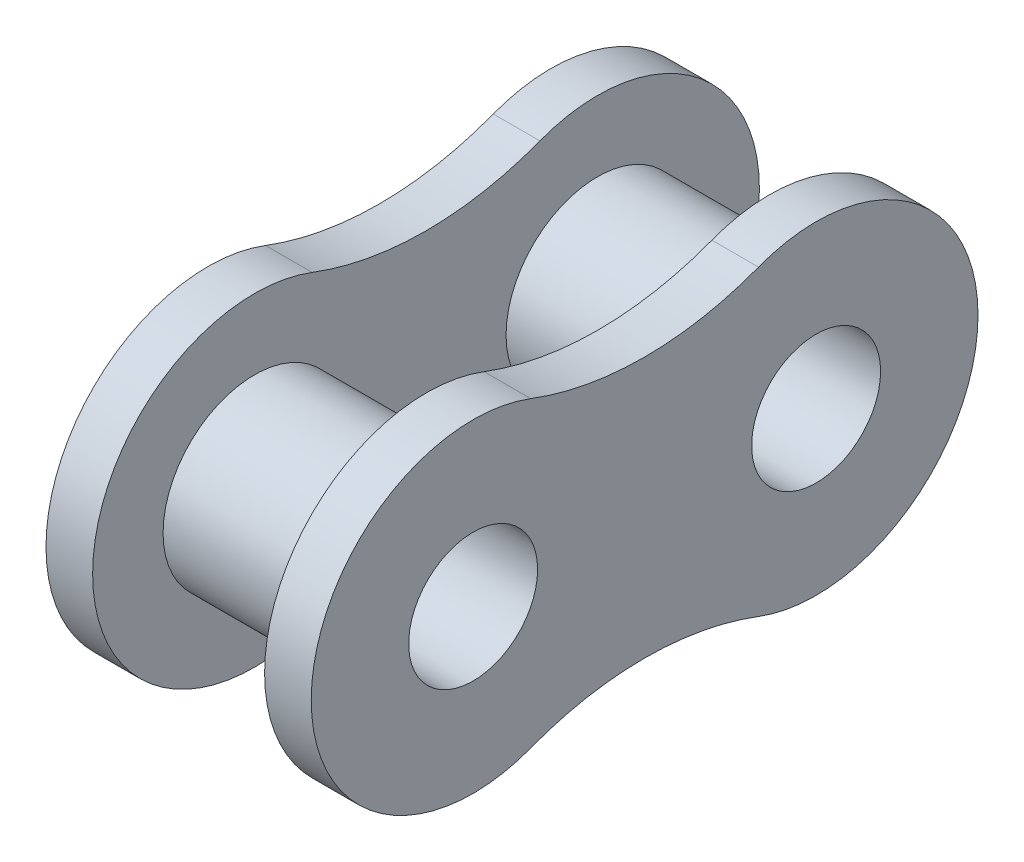
ISO-10303-21;
HEADER;
FILE_DESCRIPTION(('STEP AP214'),'2;1');
FILE_NAME('part.step','',(''),(''),'','','');
FILE_SCHEMA(('AUTOMOTIVE_DESIGN { 1 0 10303 214 1 1 1 1 }'));
ENDSEC;
DATA;
#1=APPLICATION_CONTEXT('core data for automotive mechanical design processes');
#2=APPLICATION_PROTOCOL_DEFINITION('international standard','automotive_design',2000,#1);
#3=PRODUCT_CONTEXT('',#1,'mechanical');
#4=PRODUCT('Part','Part','',(#3));
#5=PRODUCT_RELATED_PRODUCT_CATEGORY('part','',(#4));
#6=PRODUCT_DEFINITION_FORMATION('','',#4);
#7=PRODUCT_DEFINITION_CONTEXT('part definition',#1,'design');
#8=PRODUCT_DEFINITION('design','',#6,#7);
#9=PRODUCT_DEFINITION_SHAPE('','',#8);
#10=(LENGTH_UNIT() NAMED_UNIT(*) SI_UNIT(.MILLI.,.METRE.));
#11=(NAMED_UNIT(*) PLANE_ANGLE_UNIT() SI_UNIT($,.RADIAN.));
#12=(NAMED_UNIT(*) SI_UNIT($,.STERADIAN.) SOLID_ANGLE_UNIT());
#13=UNCERTAINTY_MEASURE_WITH_UNIT(LENGTH_MEASURE(1.E-05),#10,'distance_accuracy_value','');
#14=(GEOMETRIC_REPRESENTATION_CONTEXT(3) GLOBAL_UNCERTAINTY_ASSIGNED_CONTEXT((#13)) GLOBAL_UNIT_ASSIGNED_CONTEXT((#10,
#11,#12)) REPRESENTATION_CONTEXT('',''));
#15=CARTESIAN_POINT('',(0.,0.,0.));
#16=DIRECTION('',(0.,0.,1.));
#17=DIRECTION('',(1.,0.,0.));
#18=AXIS2_PLACEMENT_3D('',#15,#16,#17);
#19=CARTESIAN_POINT('',(-3.683,12.5099254749978,-4.7625));
#20=DIRECTION('',(1.,0.,0.));
#21=DIRECTION('',(0.,0.,-1.));
#22=AXIS2_PLACEMENT_3D('',#19,#20,#21);
#23=CYLINDRICAL_SURFACE('',#22,8.89);
#24=CARTESIAN_POINT('',(-2.3876,12.5099254749978,-4.7625));
#25=DIRECTION('',(1.,0.,0.));
#26=DIRECTION('',(0.,0.,-1.));
#27=AXIS2_PLACEMENT_3D('',#24,#25,#26);
#28=CIRCLE('',#27,8.89);
#29=CARTESIAN_POINT('',(-2.3876,4.201625823671,-1.59954933586338));
#30=VERTEX_POINT('',#29);
#31=CARTESIAN_POINT('',(-2.3876,4.201625823671,-7.92545066413661));
#32=VERTEX_POINT('',#31);
#33=EDGE_CURVE('E185',#30,#32,#28,.T.);
#34=ORIENTED_EDGE('',*,*,#33,.T.);
#35=DIRECTION('',(1.,0.,0.));
#36=VECTOR('',#35,1.);
#37=CARTESIAN_POINT('',(-3.683,4.201625823671,-7.92545066413661));
#38=LINE('',#37,#36);
#39=CARTESIAN_POINT('',(-3.683,4.201625823671,-7.92545066413661));
#40=VERTEX_POINT('',#39);
#41=EDGE_CURVE('E13',#40,#32,#38,.T.);
#42=ORIENTED_EDGE('',*,*,#41,.F.);
#43=CARTESIAN_POINT('',(-3.683,12.5099254749978,-4.7625));
#44=DIRECTION('',(1.,0.,0.));
#45=DIRECTION('',(0.,0.,-1.));
#46=AXIS2_PLACEMENT_3D('',#43,#44,#45);
#47=CIRCLE('',#46,8.89);
#48=CARTESIAN_POINT('',(-3.683,4.201625823671,-1.59954933586338));
#49=VERTEX_POINT('',#48);
#50=EDGE_CURVE('E158',#49,#40,#47,.T.);
#51=ORIENTED_EDGE('',*,*,#50,.F.);
#52=DIRECTION('',(1.,0.,0.));
#53=VECTOR('',#52,1.);
#54=CARTESIAN_POINT('',(-3.683,4.201625823671,-1.59954933586338));
#55=LINE('',#54,#53);
#56=EDGE_CURVE('E131',#49,#30,#55,.T.);
#57=ORIENTED_EDGE('',*,*,#56,.T.);
#58=EDGE_LOOP('',(#34,#42,#51,#57));
#59=FACE_BOUND('',#58,.T.);
#60=ADVANCED_FACE('F120',(#59),#23,.F.);
#61=CARTESIAN_POINT('',(-3.683,0.,-9.525));
#62=DIRECTION('',(1.,0.,0.));
#63=DIRECTION('',(0.,0.,-1.));
#64=AXIS2_PLACEMENT_3D('',#61,#62,#63);
#65=CYLINDRICAL_SURFACE('',#64,4.4958);
#66=CARTESIAN_POINT('',(-2.3876,0.,-9.525));
#67=DIRECTION('',(1.,0.,0.));
#68=DIRECTION('',(0.,0.,-1.));
#69=AXIS2_PLACEMENT_3D('',#66,#67,#68);
#70=CIRCLE('',#69,4.4958);
#71=CARTESIAN_POINT('',(-2.3876,-4.201625823671,-7.92545066413662));
#72=VERTEX_POINT('',#71);
#73=EDGE_CURVE('E169',#72,#32,#70,.T.);
#74=ORIENTED_EDGE('',*,*,#73,.F.);
#75=DIRECTION('',(1.,0.,0.));
#76=VECTOR('',#75,1.);
#77=CARTESIAN_POINT('',(-3.683,-4.201625823671,-7.92545066413662));
#78=LINE('',#77,#76);
#79=CARTESIAN_POINT('',(-3.683,-4.201625823671,-7.92545066413662));
#80=VERTEX_POINT('',#79);
#81=EDGE_CURVE('E124',#80,#72,#78,.T.);
#82=ORIENTED_EDGE('',*,*,#81,.F.);
#83=CARTESIAN_POINT('',(-3.683,0.,-9.525));
#84=DIRECTION('',(1.,0.,0.));
#85=DIRECTION('',(0.,0.,-1.));
#86=AXIS2_PLACEMENT_3D('',#83,#84,#85);
#87=CIRCLE('',#86,4.4958);
#88=EDGE_CURVE('E167',#80,#40,#87,.T.);
#89=ORIENTED_EDGE('',*,*,#88,.T.);
#90=ORIENTED_EDGE('',*,*,#41,.T.);
#91=EDGE_LOOP('',(#74,#82,#89,#90));
#92=FACE_BOUND('',#91,.T.);
#93=ADVANCED_FACE('F164',(#92),#65,.T.);
#94=CARTESIAN_POINT('',(-3.683,-12.5099254749978,-4.7625));
#95=DIRECTION('',(1.,0.,0.));
#96=DIRECTION('',(0.,0.,-1.));
#97=AXIS2_PLACEMENT_3D('',#94,#95,#96);
#98=CYLINDRICAL_SURFACE('',#97,8.89);
#99=CARTESIAN_POINT('',(-2.3876,-12.5099254749978,-4.7625));
#100=DIRECTION('',(1.,0.,0.));
#101=DIRECTION('',(0.,0.,-1.));
#102=AXIS2_PLACEMENT_3D('',#99,#100,#101);
#103=CIRCLE('',#102,8.89);
#104=CARTESIAN_POINT('',(-2.3876,-4.201625823671,-1.59954933586338));
#105=VERTEX_POINT('',#104);
#106=EDGE_CURVE('E188',#72,#105,#103,.T.);
#107=ORIENTED_EDGE('',*,*,#106,.T.);
#108=DIRECTION('',(1.,0.,0.));
#109=VECTOR('',#108,1.);
#110=CARTESIAN_POINT('',(-3.683,-4.201625823671,-1.59954933586338));
#111=LINE('',#110,#109);
#112=CARTESIAN_POINT('',(-3.683,-4.201625823671,-1.59954933586338));
#113=VERTEX_POINT('',#112);
#114=EDGE_CURVE('E150',#113,#105,#111,.T.);
#115=ORIENTED_EDGE('',*,*,#114,.F.);
#116=CARTESIAN_POINT('',(-3.683,-12.5099254749978,-4.7625));
#117=DIRECTION('',(1.,0.,0.));
#118=DIRECTION('',(0.,0.,-1.));
#119=AXIS2_PLACEMENT_3D('',#116,#117,#118);
#120=CIRCLE('',#119,8.89);
#121=EDGE_CURVE('E173',#80,#113,#120,.T.);
#122=ORIENTED_EDGE('',*,*,#121,.F.);
#123=ORIENTED_EDGE('',*,*,#81,.T.);
#124=EDGE_LOOP('',(#107,#115,#122,#123));
#125=FACE_BOUND('',#124,.T.);
#126=ADVANCED_FACE('F175',(#125),#98,.F.);
#127=CARTESIAN_POINT('',(-3.683,0.,0.));
#128=DIRECTION('',(1.,0.,0.));
#129=DIRECTION('',(0.,0.,-1.));
#130=AXIS2_PLACEMENT_3D('',#127,#128,#129);
#131=CYLINDRICAL_SURFACE('',#130,4.4958);
#132=CARTESIAN_POINT('',(-2.3876,0.,0.));
#133=DIRECTION('',(1.,0.,0.));
#134=DIRECTION('',(0.,0.,-1.));
#135=AXIS2_PLACEMENT_3D('',#132,#133,#134);
#136=CIRCLE('',#135,4.4958);
#137=EDGE_CURVE('E180',#30,#105,#136,.T.);
#138=ORIENTED_EDGE('',*,*,#137,.F.);
#139=ORIENTED_EDGE('',*,*,#56,.F.);
#140=CARTESIAN_POINT('',(-3.683,0.,0.));
#141=DIRECTION('',(1.,0.,0.));
#142=DIRECTION('',(0.,0.,-1.));
#143=AXIS2_PLACEMENT_3D('',#140,#141,#142);
#144=CIRCLE('',#143,4.4958);
#145=EDGE_CURVE('E171',#49,#113,#144,.T.);
#146=ORIENTED_EDGE('',*,*,#145,.T.);
#147=ORIENTED_EDGE('',*,*,#114,.T.);
#148=EDGE_LOOP('',(#138,#139,#146,#147));
#149=FACE_BOUND('',#148,.T.);
#150=ADVANCED_FACE('F191',(#149),#131,.T.);
#151=CARTESIAN_POINT('',(-3.683,6.25496273749892,-7.14375));
#152=DIRECTION('',(1.,0.,0.));
#153=DIRECTION('',(0.,0.,-1.));
#154=AXIS2_PLACEMENT_3D('',#151,#152,#153);
#155=PLANE('',#154);
#156=CARTESIAN_POINT('',(-3.683,0.,0.));
#157=DIRECTION('',(1.,0.,0.));
#158=DIRECTION('',(0.,0.,-1.));
#159=AXIS2_PLACEMENT_3D('',#156,#157,#158);
#160=CIRCLE('',#159,1.7907);
#161=CARTESIAN_POINT('',(-3.683,0.,-1.7907));
#162=VERTEX_POINT('',#161);
#163=EDGE_CURVE('E259',#162,#162,#160,.T.);
#164=ORIENTED_EDGE('',*,*,#163,.T.);
#165=EDGE_LOOP('',(#164));
#166=FACE_BOUND('',#165,.T.);
#167=CARTESIAN_POINT('',(-3.683,0.,-9.525));
#168=DIRECTION('',(1.,0.,0.));
#169=DIRECTION('',(0.,0.,-1.));
#170=AXIS2_PLACEMENT_3D('',#167,#168,#169);
#171=CIRCLE('',#170,1.7907);
#172=CARTESIAN_POINT('',(-3.683,0.,-11.3157));
#173=VERTEX_POINT('',#172);
#174=EDGE_CURVE('E184',#173,#173,#171,.T.);
#175=ORIENTED_EDGE('',*,*,#174,.T.);
#176=EDGE_LOOP('',(#175));
#177=FACE_BOUND('',#176,.T.);
#178=ORIENTED_EDGE('',*,*,#50,.T.);
#179=ORIENTED_EDGE('',*,*,#88,.F.);
#180=ORIENTED_EDGE('',*,*,#121,.T.);
#181=ORIENTED_EDGE('',*,*,#145,.F.);
#182=EDGE_LOOP('',(#178,#179,#180,#181));
#183=FACE_BOUND('',#182,.T.);
#184=ADVANCED_FACE('F174',(#166,#177,#183),#155,.F.);
#185=CARTESIAN_POINT('',(-2.3876,6.25496273749892,-7.14375));
#186=DIRECTION('',(1.,0.,0.));
#187=DIRECTION('',(0.,0.,-1.));
#188=AXIS2_PLACEMENT_3D('',#185,#186,#187);
#189=PLANE('',#188);
#190=CARTESIAN_POINT('',(-2.3876,0.,0.));
#191=DIRECTION('',(1.,0.,0.));
#192=DIRECTION('',(0.,0.,-1.));
#193=AXIS2_PLACEMENT_3D('',#190,#191,#192);
#194=CIRCLE('',#193,1.7907);
#195=CARTESIAN_POINT('',(-2.3876,0.,-1.7907));
#196=VERTEX_POINT('',#195);
#197=EDGE_CURVE('E265',#196,#196,#194,.T.);
#198=ORIENTED_EDGE('',*,*,#197,.F.);
#199=EDGE_LOOP('',(#198));
#200=FACE_BOUND('',#199,.T.);
#201=CARTESIAN_POINT('',(-2.3876,0.,-9.525));
#202=DIRECTION('',(1.,0.,0.));
#203=DIRECTION('',(0.,0.,-1.));
#204=AXIS2_PLACEMENT_3D('',#201,#202,#203);
#205=CIRCLE('',#204,1.7907);
#206=CARTESIAN_POINT('',(-2.3876,0.,-11.3157));
#207=VERTEX_POINT('',#206);
#208=EDGE_CURVE('E262',#207,#207,#205,.T.);
#209=ORIENTED_EDGE('',*,*,#208,.F.);
#210=EDGE_LOOP('',(#209));
#211=FACE_BOUND('',#210,.T.);
#212=ORIENTED_EDGE('',*,*,#33,.F.);
#213=ORIENTED_EDGE('',*,*,#137,.T.);
#214=ORIENTED_EDGE('',*,*,#106,.F.);
#215=ORIENTED_EDGE('',*,*,#73,.T.);
#216=EDGE_LOOP('',(#212,#213,#214,#215));
#217=FACE_BOUND('',#216,.T.);
#218=ADVANCED_FACE('F195',(#200,#211,#217),#189,.T.);
#219=CARTESIAN_POINT('',(-3.683,0.,-9.525));
#220=DIRECTION('',(1.,0.,0.));
#221=DIRECTION('',(0.,0.,-1.));
#222=AXIS2_PLACEMENT_3D('',#219,#220,#221);
#223=CYLINDRICAL_SURFACE('',#222,1.7907);
#224=ORIENTED_EDGE('',*,*,#174,.F.);
#225=EDGE_LOOP('',(#224));
#226=FACE_BOUND('',#225,.T.);
#227=ORIENTED_EDGE('',*,*,#208,.T.);
#228=EDGE_LOOP('',(#227));
#229=FACE_BOUND('',#228,.T.);
#230=ADVANCED_FACE('F231',(#226,#229),#223,.F.);
#231=CARTESIAN_POINT('',(-3.683,0.,0.));
#232=DIRECTION('',(1.,0.,0.));
#233=DIRECTION('',(0.,0.,-1.));
#234=AXIS2_PLACEMENT_3D('',#231,#232,#233);
#235=CYLINDRICAL_SURFACE('',#234,1.7907);
#236=ORIENTED_EDGE('',*,*,#163,.F.);
#237=EDGE_LOOP('',(#236));
#238=FACE_BOUND('',#237,.T.);
#239=ORIENTED_EDGE('',*,*,#197,.T.);
#240=EDGE_LOOP('',(#239));
#241=FACE_BOUND('',#240,.T.);
#242=ADVANCED_FACE('F248',(#238,#241),#235,.F.);
#243=CLOSED_SHELL('',(#60,#93,#126,#150,#184,#218,#230,#242));
#244=MANIFOLD_SOLID_BREP('B2',#243);
#245=CARTESIAN_POINT('',(2.3876,6.25496273749892,-7.14375));
#246=DIRECTION('',(1.,0.,0.));
#247=DIRECTION('',(0.,0.,-1.));
#248=AXIS2_PLACEMENT_3D('',#245,#246,#247);
#249=PLANE('',#248);
#250=CARTESIAN_POINT('',(2.3876,12.5099254749978,-4.7625));
#251=DIRECTION('',(1.,0.,0.));
#252=DIRECTION('',(0.,0.,-1.));
#253=AXIS2_PLACEMENT_3D('',#250,#251,#252);
#254=CIRCLE('',#253,8.89);
#255=CARTESIAN_POINT('',(2.3876,4.201625823671,-1.59954933586338));
#256=VERTEX_POINT('',#255);
#257=CARTESIAN_POINT('',(2.3876,4.201625823671,-7.92545066413661));
#258=VERTEX_POINT('',#257);
#259=EDGE_CURVE('E346',#256,#258,#254,.T.);
#260=ORIENTED_EDGE('',*,*,#259,.T.);
#261=CARTESIAN_POINT('',(2.3876,0.,-9.525));
#262=DIRECTION('',(1.,0.,0.));
#263=DIRECTION('',(0.,0.,-1.));
#264=AXIS2_PLACEMENT_3D('',#261,#262,#263);
#265=CIRCLE('',#264,4.4958);
#266=CARTESIAN_POINT('',(2.3876,-4.201625823671,-7.92545066413662));
#267=VERTEX_POINT('',#266);
#268=EDGE_CURVE('E353',#267,#258,#265,.T.);
#269=ORIENTED_EDGE('',*,*,#268,.F.);
#270=CARTESIAN_POINT('',(2.3876,-12.5099254749978,-4.7625));
#271=DIRECTION('',(1.,0.,0.));
#272=DIRECTION('',(0.,0.,-1.));
#273=AXIS2_PLACEMENT_3D('',#270,#271,#272);
#274=CIRCLE('',#273,8.89);
#275=CARTESIAN_POINT('',(2.3876,-4.201625823671,-1.59954933586338));
#276=VERTEX_POINT('',#275);
#277=EDGE_CURVE('E335',#267,#276,#274,.T.);
#278=ORIENTED_EDGE('',*,*,#277,.T.);
#279=CARTESIAN_POINT('',(2.3876,0.,0.));
#280=DIRECTION('',(1.,0.,0.));
#281=DIRECTION('',(0.,0.,-1.));
#282=AXIS2_PLACEMENT_3D('',#279,#280,#281);
#283=CIRCLE('',#282,4.4958);
#284=EDGE_CURVE('E354',#256,#276,#283,.T.);
#285=ORIENTED_EDGE('',*,*,#284,.F.);
#286=EDGE_LOOP('',(#260,#269,#278,#285));
#287=FACE_BOUND('',#286,.T.);
#288=CARTESIAN_POINT('',(2.3876,0.,-9.525));
#289=DIRECTION('',(1.,0.,0.));
#290=DIRECTION('',(0.,0.,-1.));
#291=AXIS2_PLACEMENT_3D('',#288,#289,#290);
#292=CIRCLE('',#291,2.54);
#293=CARTESIAN_POINT('',(2.3876,0.,-12.065));
#294=VERTEX_POINT('',#293);
#295=EDGE_CURVE('E286',#294,#294,#292,.T.);
#296=ORIENTED_EDGE('',*,*,#295,.T.);
#297=EDGE_LOOP('',(#296));
#298=FACE_BOUND('',#297,.T.);
#299=CARTESIAN_POINT('',(2.3876,0.,0.));
#300=DIRECTION('',(1.,0.,0.));
#301=DIRECTION('',(0.,0.,-1.));
#302=AXIS2_PLACEMENT_3D('',#299,#300,#301);
#303=CIRCLE('',#302,2.54);
#304=CARTESIAN_POINT('',(2.3876,0.,-2.54));
#305=VERTEX_POINT('',#304);
#306=EDGE_CURVE('E113',#305,#305,#303,.F.);
#307=ORIENTED_EDGE('',*,*,#306,.F.);
#308=EDGE_LOOP('',(#307));
#309=FACE_BOUND('',#308,.T.);
#310=ADVANCED_FACE('F276',(#287,#298,#309),#249,.F.);
#311=CARTESIAN_POINT('',(2.3876,0.,-9.525));
#312=DIRECTION('',(-1.,0.,0.));
#313=DIRECTION('',(0.,0.,1.));
#314=AXIS2_PLACEMENT_3D('',#311,#312,#313);
#315=CYLINDRICAL_SURFACE('',#314,1.7907);
#316=CARTESIAN_POINT('',(-2.3876,0.,-9.525));
#317=DIRECTION('',(1.,0.,0.));
#318=DIRECTION('',(0.,0.,-1.));
#319=AXIS2_PLACEMENT_3D('',#316,#317,#318);
#320=CIRCLE('',#319,1.7907);
#321=CARTESIAN_POINT('',(-2.3876,0.,-11.3157));
#322=VERTEX_POINT('',#321);
#323=EDGE_CURVE('E356',#322,#322,#320,.T.);
#324=ORIENTED_EDGE('',*,*,#323,.F.);
#325=EDGE_LOOP('',(#324));
#326=FACE_BOUND('',#325,.T.);
#327=CARTESIAN_POINT('',(3.683,0.,-9.525));
#328=DIRECTION('',(1.,0.,0.));
#329=DIRECTION('',(0.,0.,-1.));
#330=AXIS2_PLACEMENT_3D('',#327,#328,#329);
#331=CIRCLE('',#330,1.7907);
#332=CARTESIAN_POINT('',(3.683,0.,-11.3157));
#333=VERTEX_POINT('',#332);
#334=EDGE_CURVE('E355',#333,#333,#331,.T.);
#335=ORIENTED_EDGE('',*,*,#334,.T.);
#336=EDGE_LOOP('',(#335));
#337=FACE_BOUND('',#336,.T.);
#338=ADVANCED_FACE('F283',(#326,#337),#315,.F.);
#339=CARTESIAN_POINT('',(2.3876,0.,-9.525));
#340=DIRECTION('',(-1.,0.,0.));
#341=DIRECTION('',(0.,0.,1.));
#342=AXIS2_PLACEMENT_3D('',#339,#340,#341);
#343=CYLINDRICAL_SURFACE('',#342,2.54);
#344=ORIENTED_EDGE('',*,*,#295,.F.);
#345=EDGE_LOOP('',(#344));
#346=FACE_BOUND('',#345,.T.);
#347=CARTESIAN_POINT('',(-2.3876,0.,-9.525));
#348=DIRECTION('',(1.,0.,0.));
#349=DIRECTION('',(0.,0.,-1.));
#350=AXIS2_PLACEMENT_3D('',#347,#348,#349);
#351=CIRCLE('',#350,2.54);
#352=CARTESIAN_POINT('',(-2.3876,0.,-12.065));
#353=VERTEX_POINT('',#352);
#354=EDGE_CURVE('E361',#353,#353,#351,.T.);
#355=ORIENTED_EDGE('',*,*,#354,.T.);
#356=EDGE_LOOP('',(#355));
#357=FACE_BOUND('',#356,.T.);
#358=ADVANCED_FACE('F366',(#346,#357),#343,.T.);
#359=CARTESIAN_POINT('',(-2.3876,0.,0.));
#360=DIRECTION('',(1.,0.,0.));
#361=DIRECTION('',(0.,0.,-1.));
#362=AXIS2_PLACEMENT_3D('',#359,#360,#361);
#363=PLANE('',#362);
#364=ORIENTED_EDGE('',*,*,#323,.T.);
#365=EDGE_LOOP('',(#364));
#366=FACE_BOUND('',#365,.T.);
#367=ORIENTED_EDGE('',*,*,#354,.F.);
#368=EDGE_LOOP('',(#367));
#369=FACE_BOUND('',#368,.T.);
#370=ADVANCED_FACE('F367',(#366,#369),#363,.F.);
#371=CARTESIAN_POINT('',(3.683,6.25496273749892,-7.14375));
#372=DIRECTION('',(1.,0.,0.));
#373=DIRECTION('',(0.,0.,-1.));
#374=AXIS2_PLACEMENT_3D('',#371,#372,#373);
#375=PLANE('',#374);
#376=ORIENTED_EDGE('',*,*,#334,.F.);
#377=EDGE_LOOP('',(#376));
#378=FACE_BOUND('',#377,.T.);
#379=CARTESIAN_POINT('',(3.683,12.5099254749978,-4.7625));
#380=DIRECTION('',(1.,0.,0.));
#381=DIRECTION('',(0.,0.,-1.));
#382=AXIS2_PLACEMENT_3D('',#379,#380,#381);
#383=CIRCLE('',#382,8.89);
#384=CARTESIAN_POINT('',(3.683,4.201625823671,-1.59954933586338));
#385=VERTEX_POINT('',#384);
#386=CARTESIAN_POINT('',(3.683,4.201625823671,-7.92545066413661));
#387=VERTEX_POINT('',#386);
#388=EDGE_CURVE('E337',#385,#387,#383,.T.);
#389=ORIENTED_EDGE('',*,*,#388,.F.);
#390=CARTESIAN_POINT('',(3.683,0.,0.));
#391=DIRECTION('',(1.,0.,0.));
#392=DIRECTION('',(0.,0.,-1.));
#393=AXIS2_PLACEMENT_3D('',#390,#391,#392);
#394=CIRCLE('',#393,4.4958);
#395=CARTESIAN_POINT('',(3.683,-4.201625823671,-1.59954933586338));
#396=VERTEX_POINT('',#395);
#397=EDGE_CURVE('E341',#385,#396,#394,.T.);
#398=ORIENTED_EDGE('',*,*,#397,.T.);
#399=CARTESIAN_POINT('',(3.683,-12.5099254749978,-4.7625));
#400=DIRECTION('',(1.,0.,0.));
#401=DIRECTION('',(0.,0.,-1.));
#402=AXIS2_PLACEMENT_3D('',#399,#400,#401);
#403=CIRCLE('',#402,8.89);
#404=CARTESIAN_POINT('',(3.683,-4.201625823671,-7.92545066413662));
#405=VERTEX_POINT('',#404);
#406=EDGE_CURVE('E329',#405,#396,#403,.T.);
#407=ORIENTED_EDGE('',*,*,#406,.F.);
#408=CARTESIAN_POINT('',(3.683,0.,-9.525));
#409=DIRECTION('',(1.,0.,0.));
#410=DIRECTION('',(0.,0.,-1.));
#411=AXIS2_PLACEMENT_3D('',#408,#409,#410);
#412=CIRCLE('',#411,4.4958);
#413=EDGE_CURVE('E324',#405,#387,#412,.T.);
#414=ORIENTED_EDGE('',*,*,#413,.T.);
#415=EDGE_LOOP('',(#389,#398,#407,#414));
#416=FACE_BOUND('',#415,.T.);
#417=CARTESIAN_POINT('',(3.683,0.,0.));
#418=DIRECTION('',(1.,0.,0.));
#419=DIRECTION('',(0.,0.,-1.));
#420=AXIS2_PLACEMENT_3D('',#417,#418,#419);
#421=CIRCLE('',#420,1.7907);
#422=CARTESIAN_POINT('',(3.683,0.,-1.7907));
#423=VERTEX_POINT('',#422);
#424=EDGE_CURVE('E408',#423,#423,#421,.T.);
#425=ORIENTED_EDGE('',*,*,#424,.F.);
#426=EDGE_LOOP('',(#425));
#427=FACE_BOUND('',#426,.T.);
#428=ADVANCED_FACE('F343',(#378,#416,#427),#375,.T.);
#429=CARTESIAN_POINT('',(3.683,12.5099254749978,-4.7625));
#430=DIRECTION('',(-1.,0.,0.));
#431=DIRECTION('',(0.,0.,1.));
#432=AXIS2_PLACEMENT_3D('',#429,#430,#431);
#433=CYLINDRICAL_SURFACE('',#432,8.89);
#434=ORIENTED_EDGE('',*,*,#259,.F.);
#435=DIRECTION('',(-1.,0.,0.));
#436=VECTOR('',#435,1.);
#437=CARTESIAN_POINT('',(3.683,4.201625823671,-1.59954933586338));
#438=LINE('',#437,#436);
#439=EDGE_CURVE('E298',#385,#256,#438,.T.);
#440=ORIENTED_EDGE('',*,*,#439,.F.);
#441=ORIENTED_EDGE('',*,*,#388,.T.);
#442=DIRECTION('',(-1.,0.,0.));
#443=VECTOR('',#442,1.);
#444=CARTESIAN_POINT('',(3.683,4.201625823671,-7.92545066413661));
#445=LINE('',#444,#443);
#446=EDGE_CURVE('E338',#387,#258,#445,.T.);
#447=ORIENTED_EDGE('',*,*,#446,.T.);
#448=EDGE_LOOP('',(#434,#440,#441,#447));
#449=FACE_BOUND('',#448,.T.);
#450=ADVANCED_FACE('F378',(#449),#433,.F.);
#451=CARTESIAN_POINT('',(3.683,0.,0.));
#452=DIRECTION('',(-1.,0.,0.));
#453=DIRECTION('',(0.,0.,1.));
#454=AXIS2_PLACEMENT_3D('',#451,#452,#453);
#455=CYLINDRICAL_SURFACE('',#454,4.4958);
#456=ORIENTED_EDGE('',*,*,#284,.T.);
#457=DIRECTION('',(-1.,0.,0.));
#458=VECTOR('',#457,1.);
#459=CARTESIAN_POINT('',(3.683,-4.201625823671,-1.59954933586338));
#460=LINE('',#459,#458);
#461=EDGE_CURVE('E314',#396,#276,#460,.T.);
#462=ORIENTED_EDGE('',*,*,#461,.F.);
#463=ORIENTED_EDGE('',*,*,#397,.F.);
#464=ORIENTED_EDGE('',*,*,#439,.T.);
#465=EDGE_LOOP('',(#456,#462,#463,#464));
#466=FACE_BOUND('',#465,.T.);
#467=ADVANCED_FACE('F391',(#466),#455,.T.);
#468=CARTESIAN_POINT('',(3.683,-12.5099254749978,-4.7625));
#469=DIRECTION('',(-1.,0.,0.));
#470=DIRECTION('',(0.,0.,1.));
#471=AXIS2_PLACEMENT_3D('',#468,#469,#470);
#472=CYLINDRICAL_SURFACE('',#471,8.89);
#473=ORIENTED_EDGE('',*,*,#277,.F.);
#474=DIRECTION('',(-1.,0.,0.));
#475=VECTOR('',#474,1.);
#476=CARTESIAN_POINT('',(3.683,-4.201625823671,-7.92545066413662));
#477=LINE('',#476,#475);
#478=EDGE_CURVE('E327',#405,#267,#477,.T.);
#479=ORIENTED_EDGE('',*,*,#478,.F.);
#480=ORIENTED_EDGE('',*,*,#406,.T.);
#481=ORIENTED_EDGE('',*,*,#461,.T.);
#482=EDGE_LOOP('',(#473,#479,#480,#481));
#483=FACE_BOUND('',#482,.T.);
#484=ADVANCED_FACE('F328',(#483),#472,.F.);
#485=CARTESIAN_POINT('',(3.683,0.,-9.525));
#486=DIRECTION('',(-1.,0.,0.));
#487=DIRECTION('',(0.,0.,1.));
#488=AXIS2_PLACEMENT_3D('',#485,#486,#487);
#489=CYLINDRICAL_SURFACE('',#488,4.4958);
#490=ORIENTED_EDGE('',*,*,#268,.T.);
#491=ORIENTED_EDGE('',*,*,#446,.F.);
#492=ORIENTED_EDGE('',*,*,#413,.F.);
#493=ORIENTED_EDGE('',*,*,#478,.T.);
#494=EDGE_LOOP('',(#490,#491,#492,#493));
#495=FACE_BOUND('',#494,.T.);
#496=ADVANCED_FACE('F336',(#495),#489,.T.);
#497=CARTESIAN_POINT('',(3.683,0.,0.));
#498=DIRECTION('',(-1.,0.,0.));
#499=DIRECTION('',(0.,0.,1.));
#500=AXIS2_PLACEMENT_3D('',#497,#498,#499);
#501=CYLINDRICAL_SURFACE('',#500,1.7907);
#502=ORIENTED_EDGE('',*,*,#424,.T.);
#503=EDGE_LOOP('',(#502));
#504=FACE_BOUND('',#503,.T.);
#505=CARTESIAN_POINT('',(-2.3876,0.,0.));
#506=DIRECTION('',(1.,0.,0.));
#507=DIRECTION('',(0.,0.,-1.));
#508=AXIS2_PLACEMENT_3D('',#505,#506,#507);
#509=CIRCLE('',#508,1.7907);
#510=CARTESIAN_POINT('',(-2.3876,0.,-1.7907));
#511=VERTEX_POINT('',#510);
#512=EDGE_CURVE('E407',#511,#511,#509,.T.);
#513=ORIENTED_EDGE('',*,*,#512,.F.);
#514=EDGE_LOOP('',(#513));
#515=FACE_BOUND('',#514,.T.);
#516=ADVANCED_FACE('F397',(#504,#515),#501,.F.);
#517=CARTESIAN_POINT('',(2.3876,0.,0.));
#518=DIRECTION('',(-1.,0.,0.));
#519=DIRECTION('',(0.,0.,1.));
#520=AXIS2_PLACEMENT_3D('',#517,#518,#519);
#521=CYLINDRICAL_SURFACE('',#520,2.54);
#522=ORIENTED_EDGE('',*,*,#306,.T.);
#523=EDGE_LOOP('',(#522));
#524=FACE_BOUND('',#523,.T.);
#525=CARTESIAN_POINT('',(-2.3876,0.,0.));
#526=DIRECTION('',(1.,0.,0.));
#527=DIRECTION('',(0.,0.,-1.));
#528=AXIS2_PLACEMENT_3D('',#525,#526,#527);
#529=CIRCLE('',#528,2.54);
#530=CARTESIAN_POINT('',(-2.3876,0.,-2.54));
#531=VERTEX_POINT('',#530);
#532=EDGE_CURVE('E415',#531,#531,#529,.T.);
#533=ORIENTED_EDGE('',*,*,#532,.T.);
#534=EDGE_LOOP('',(#533));
#535=FACE_BOUND('',#534,.T.);
#536=ADVANCED_FACE('F418',(#524,#535),#521,.T.);
#537=CARTESIAN_POINT('',(-2.3876,0.,0.));
#538=DIRECTION('',(1.,0.,0.));
#539=DIRECTION('',(0.,0.,-1.));
#540=AXIS2_PLACEMENT_3D('',#537,#538,#539);
#541=PLANE('',#540);
#542=ORIENTED_EDGE('',*,*,#532,.F.);
#543=EDGE_LOOP('',(#542));
#544=FACE_BOUND('',#543,.T.);
#545=ORIENTED_EDGE('',*,*,#512,.T.);
#546=EDGE_LOOP('',(#545));
#547=FACE_BOUND('',#546,.T.);
#548=ADVANCED_FACE('F416',(#544,#547),#541,.F.);
#549=CLOSED_SHELL('',(#310,#338,#358,#370,#428,#450,#467,#484,#496,#516,#536,#548));
#550=MANIFOLD_SOLID_BREP('B7',#549);
#551=ADVANCED_BREP_SHAPE_REPRESENTATION('',(#18,#244,#550),#14);
#552=SHAPE_DEFINITION_REPRESENTATION(#9,#551);
ENDSEC;
END-ISO-10303-21;
